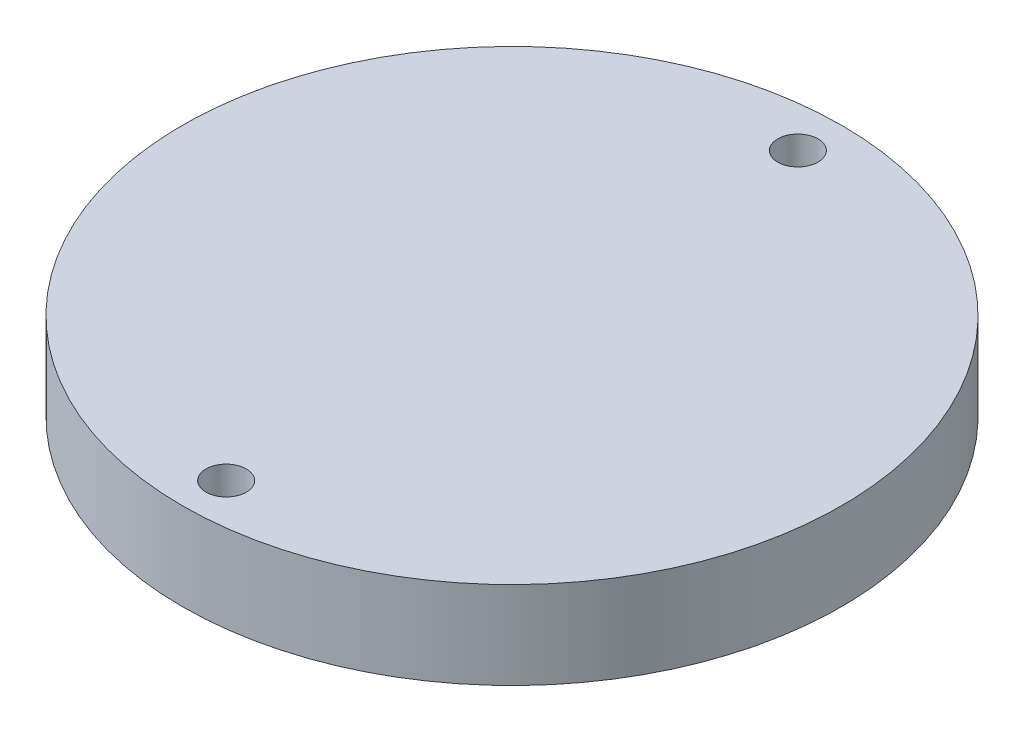
ISO-10303-21;
HEADER;
FILE_DESCRIPTION(('STEP AP214'),'2;1');
FILE_NAME('part.step','',(''),(''),'','','');
FILE_SCHEMA(('AUTOMOTIVE_DESIGN { 1 0 10303 214 1 1 1 1 }'));
ENDSEC;
DATA;
#1=APPLICATION_CONTEXT('core data for automotive mechanical design processes');
#2=APPLICATION_PROTOCOL_DEFINITION('international standard','automotive_design',2000,#1);
#3=PRODUCT_CONTEXT('',#1,'mechanical');
#4=PRODUCT('Part','Part','',(#3));
#5=PRODUCT_RELATED_PRODUCT_CATEGORY('part','',(#4));
#6=PRODUCT_DEFINITION_FORMATION('','',#4);
#7=PRODUCT_DEFINITION_CONTEXT('part definition',#1,'design');
#8=PRODUCT_DEFINITION('design','',#6,#7);
#9=PRODUCT_DEFINITION_SHAPE('','',#8);
#10=(LENGTH_UNIT() NAMED_UNIT(*) SI_UNIT(.MILLI.,.METRE.));
#11=(NAMED_UNIT(*) PLANE_ANGLE_UNIT() SI_UNIT($,.RADIAN.));
#12=(NAMED_UNIT(*) SI_UNIT($,.STERADIAN.) SOLID_ANGLE_UNIT());
#13=UNCERTAINTY_MEASURE_WITH_UNIT(LENGTH_MEASURE(1.E-05),#10,'distance_accuracy_value','');
#14=(GEOMETRIC_REPRESENTATION_CONTEXT(3) GLOBAL_UNCERTAINTY_ASSIGNED_CONTEXT((#13)) GLOBAL_UNIT_ASSIGNED_CONTEXT((#10,
#11,#12)) REPRESENTATION_CONTEXT('',''));
#15=CARTESIAN_POINT('',(0.,0.,0.));
#16=DIRECTION('',(0.,0.,1.));
#17=DIRECTION('',(1.,0.,0.));
#18=AXIS2_PLACEMENT_3D('',#15,#16,#17);
#19=CARTESIAN_POINT('',(0.,0.,0.));
#20=DIRECTION('',(0.,1.,0.));
#21=DIRECTION('',(0.,0.,1.));
#22=AXIS2_PLACEMENT_3D('',#19,#20,#21);
#23=PLANE('',#22);
#24=CARTESIAN_POINT('',(0.,0.,-21.25));
#25=DIRECTION('',(0.,-1.,0.));
#26=DIRECTION('',(0.,0.,-1.));
#27=AXIS2_PLACEMENT_3D('',#24,#25,#26);
#28=CIRCLE('',#27,1.5);
#29=CARTESIAN_POINT('',(0.,0.,-22.75));
#30=VERTEX_POINT('',#29);
#31=EDGE_CURVE('E62',#30,#30,#28,.T.);
#32=ORIENTED_EDGE('',*,*,#31,.F.);
#33=EDGE_LOOP('',(#32));
#34=FACE_BOUND('',#33,.T.);
#35=CARTESIAN_POINT('',(0.,0.,21.25));
#36=DIRECTION('',(0.,-1.,0.));
#37=DIRECTION('',(0.,0.,-1.));
#38=AXIS2_PLACEMENT_3D('',#35,#36,#37);
#39=CIRCLE('',#38,1.5);
#40=CARTESIAN_POINT('',(0.,0.,19.75));
#41=VERTEX_POINT('',#40);
#42=EDGE_CURVE('E59',#41,#41,#39,.T.);
#43=ORIENTED_EDGE('',*,*,#42,.F.);
#44=EDGE_LOOP('',(#43));
#45=FACE_BOUND('',#44,.T.);
#46=CARTESIAN_POINT('',(0.,0.,0.));
#47=DIRECTION('',(0.,1.,0.));
#48=DIRECTION('',(0.,0.,1.));
#49=AXIS2_PLACEMENT_3D('',#46,#47,#48);
#50=CIRCLE('',#49,24.5);
#51=CARTESIAN_POINT('',(0.,0.,24.5));
#52=VERTEX_POINT('',#51);
#53=EDGE_CURVE('E10',#52,#52,#50,.T.);
#54=ORIENTED_EDGE('',*,*,#53,.F.);
#55=EDGE_LOOP('',(#54));
#56=FACE_BOUND('',#55,.T.);
#57=CARTESIAN_POINT('',(0.,0.,0.));
#58=DIRECTION('',(0.,1.,0.));
#59=DIRECTION('',(0.,0.,1.));
#60=AXIS2_PLACEMENT_3D('',#57,#58,#59);
#61=CIRCLE('',#60,18.5);
#62=CARTESIAN_POINT('',(0.,0.,18.5));
#63=VERTEX_POINT('',#62);
#64=EDGE_CURVE('E42',#63,#63,#61,.T.);
#65=ORIENTED_EDGE('',*,*,#64,.T.);
#66=EDGE_LOOP('',(#65));
#67=FACE_BOUND('',#66,.T.);
#68=ADVANCED_FACE('F35',(#34,#45,#56,#67),#23,.F.);
#69=CARTESIAN_POINT('',(0.,4.5,0.));
#70=DIRECTION('',(0.,-1.,0.));
#71=DIRECTION('',(0.,0.,-1.));
#72=AXIS2_PLACEMENT_3D('',#69,#70,#71);
#73=CYLINDRICAL_SURFACE('',#72,24.5);
#74=ORIENTED_EDGE('',*,*,#53,.T.);
#75=EDGE_LOOP('',(#74));
#76=FACE_BOUND('',#75,.T.);
#77=CARTESIAN_POINT('',(0.,6.5,0.));
#78=DIRECTION('',(0.,1.,0.));
#79=DIRECTION('',(0.,0.,1.));
#80=AXIS2_PLACEMENT_3D('',#77,#78,#79);
#81=CIRCLE('',#80,24.5);
#82=CARTESIAN_POINT('',(0.,6.5,24.5));
#83=VERTEX_POINT('',#82);
#84=EDGE_CURVE('E50',#83,#83,#81,.T.);
#85=ORIENTED_EDGE('',*,*,#84,.F.);
#86=EDGE_LOOP('',(#85));
#87=FACE_BOUND('',#86,.T.);
#88=ADVANCED_FACE('F37',(#76,#87),#73,.T.);
#89=CARTESIAN_POINT('',(0.,4.5,0.));
#90=DIRECTION('',(0.,-1.,0.));
#91=DIRECTION('',(0.,0.,-1.));
#92=AXIS2_PLACEMENT_3D('',#89,#90,#91);
#93=CYLINDRICAL_SURFACE('',#92,18.5);
#94=CARTESIAN_POINT('',(0.,4.5,0.));
#95=DIRECTION('',(0.,1.,0.));
#96=DIRECTION('',(0.,0.,1.));
#97=AXIS2_PLACEMENT_3D('',#94,#95,#96);
#98=CIRCLE('',#97,18.5);
#99=CARTESIAN_POINT('',(0.,4.5,18.5));
#100=VERTEX_POINT('',#99);
#101=EDGE_CURVE('E46',#100,#100,#98,.T.);
#102=ORIENTED_EDGE('',*,*,#101,.T.);
#103=EDGE_LOOP('',(#102));
#104=FACE_BOUND('',#103,.T.);
#105=ORIENTED_EDGE('',*,*,#64,.F.);
#106=EDGE_LOOP('',(#105));
#107=FACE_BOUND('',#106,.T.);
#108=ADVANCED_FACE('F95',(#104,#107),#93,.F.);
#109=CARTESIAN_POINT('',(0.,4.5,0.));
#110=DIRECTION('',(0.,1.,0.));
#111=DIRECTION('',(0.,0.,1.));
#112=AXIS2_PLACEMENT_3D('',#109,#110,#111);
#113=PLANE('',#112);
#114=ORIENTED_EDGE('',*,*,#101,.F.);
#115=EDGE_LOOP('',(#114));
#116=FACE_BOUND('',#115,.T.);
#117=ADVANCED_FACE('F89',(#116),#113,.F.);
#118=CARTESIAN_POINT('',(0.,6.5,0.));
#119=DIRECTION('',(0.,1.,0.));
#120=DIRECTION('',(0.,0.,1.));
#121=AXIS2_PLACEMENT_3D('',#118,#119,#120);
#122=PLANE('',#121);
#123=CARTESIAN_POINT('',(0.,6.5,-21.25));
#124=DIRECTION('',(0.,-1.,0.));
#125=DIRECTION('',(0.,0.,-1.));
#126=AXIS2_PLACEMENT_3D('',#123,#124,#125);
#127=CIRCLE('',#126,1.5);
#128=CARTESIAN_POINT('',(0.,6.5,-22.75));
#129=VERTEX_POINT('',#128);
#130=EDGE_CURVE('E55',#129,#129,#127,.T.);
#131=ORIENTED_EDGE('',*,*,#130,.T.);
#132=EDGE_LOOP('',(#131));
#133=FACE_BOUND('',#132,.T.);
#134=CARTESIAN_POINT('',(0.,6.5,21.25));
#135=DIRECTION('',(0.,-1.,0.));
#136=DIRECTION('',(0.,0.,-1.));
#137=AXIS2_PLACEMENT_3D('',#134,#135,#136);
#138=CIRCLE('',#137,1.5);
#139=CARTESIAN_POINT('',(0.,6.5,19.75));
#140=VERTEX_POINT('',#139);
#141=EDGE_CURVE('E56',#140,#140,#138,.T.);
#142=ORIENTED_EDGE('',*,*,#141,.T.);
#143=EDGE_LOOP('',(#142));
#144=FACE_BOUND('',#143,.T.);
#145=ORIENTED_EDGE('',*,*,#84,.T.);
#146=EDGE_LOOP('',(#145));
#147=FACE_BOUND('',#146,.T.);
#148=ADVANCED_FACE('F68',(#133,#144,#147),#122,.T.);
#149=CARTESIAN_POINT('',(0.,6.5,21.25));
#150=DIRECTION('',(0.,-1.,0.));
#151=DIRECTION('',(0.,0.,-1.));
#152=AXIS2_PLACEMENT_3D('',#149,#150,#151);
#153=CYLINDRICAL_SURFACE('',#152,1.5);
#154=CARTESIAN_POINT('',(0.,6.5,19.75));
#155=CARTESIAN_POINT('',(0.,6.43229166666667,19.75));
#156=CARTESIAN_POINT('',(0.,6.36458333333333,19.75));
#157=CARTESIAN_POINT('',(0.,6.22916666666667,19.75));
#158=CARTESIAN_POINT('',(0.,6.16145833333333,19.75));
#159=CARTESIAN_POINT('',(0.,6.02604166666667,19.75));
#160=CARTESIAN_POINT('',(0.,5.95833333333333,19.75));
#161=CARTESIAN_POINT('',(0.,5.82291666666667,19.75));
#162=CARTESIAN_POINT('',(0.,5.75520833333333,19.75));
#163=CARTESIAN_POINT('',(0.,5.61979166666667,19.75));
#164=CARTESIAN_POINT('',(0.,5.55208333333333,19.75));
#165=CARTESIAN_POINT('',(0.,5.41666666666667,19.75));
#166=CARTESIAN_POINT('',(0.,5.34895833333333,19.75));
#167=CARTESIAN_POINT('',(0.,5.21354166666667,19.75));
#168=CARTESIAN_POINT('',(0.,5.14583333333333,19.75));
#169=CARTESIAN_POINT('',(0.,5.01041666666667,19.75));
#170=CARTESIAN_POINT('',(0.,4.94270833333333,19.75));
#171=CARTESIAN_POINT('',(0.,4.80729166666667,19.75));
#172=CARTESIAN_POINT('',(0.,4.73958333333333,19.75));
#173=CARTESIAN_POINT('',(0.,4.60416666666667,19.75));
#174=CARTESIAN_POINT('',(0.,4.53645833333333,19.75));
#175=CARTESIAN_POINT('',(0.,4.40104166666667,19.75));
#176=CARTESIAN_POINT('',(0.,4.33333333333333,19.75));
#177=CARTESIAN_POINT('',(0.,4.19791666666667,19.75));
#178=CARTESIAN_POINT('',(0.,4.13020833333333,19.75));
#179=CARTESIAN_POINT('',(0.,3.99479166666667,19.75));
#180=CARTESIAN_POINT('',(0.,3.92708333333333,19.75));
#181=CARTESIAN_POINT('',(0.,3.79166666666667,19.75));
#182=CARTESIAN_POINT('',(0.,3.72395833333333,19.75));
#183=CARTESIAN_POINT('',(0.,3.58854166666667,19.75));
#184=CARTESIAN_POINT('',(0.,3.52083333333333,19.75));
#185=CARTESIAN_POINT('',(0.,3.38541666666667,19.75));
#186=CARTESIAN_POINT('',(0.,3.31770833333333,19.75));
#187=CARTESIAN_POINT('',(0.,3.18229166666667,19.75));
#188=CARTESIAN_POINT('',(0.,3.11458333333333,19.75));
#189=CARTESIAN_POINT('',(0.,2.97916666666667,19.75));
#190=CARTESIAN_POINT('',(0.,2.91145833333333,19.75));
#191=CARTESIAN_POINT('',(0.,2.77604166666667,19.75));
#192=CARTESIAN_POINT('',(0.,2.70833333333333,19.75));
#193=CARTESIAN_POINT('',(0.,2.57291666666667,19.75));
#194=CARTESIAN_POINT('',(0.,2.50520833333333,19.75));
#195=CARTESIAN_POINT('',(0.,2.36979166666667,19.75));
#196=CARTESIAN_POINT('',(0.,2.30208333333333,19.75));
#197=CARTESIAN_POINT('',(0.,2.16666666666667,19.75));
#198=CARTESIAN_POINT('',(0.,2.09895833333333,19.75));
#199=CARTESIAN_POINT('',(0.,1.96354166666667,19.75));
#200=CARTESIAN_POINT('',(0.,1.89583333333333,19.75));
#201=CARTESIAN_POINT('',(0.,1.76041666666667,19.75));
#202=CARTESIAN_POINT('',(0.,1.69270833333333,19.75));
#203=CARTESIAN_POINT('',(0.,1.55729166666667,19.75));
#204=CARTESIAN_POINT('',(0.,1.48958333333333,19.75));
#205=CARTESIAN_POINT('',(0.,1.35416666666667,19.75));
#206=CARTESIAN_POINT('',(0.,1.28645833333333,19.75));
#207=CARTESIAN_POINT('',(0.,1.15104166666667,19.75));
#208=CARTESIAN_POINT('',(0.,1.08333333333333,19.75));
#209=CARTESIAN_POINT('',(0.,0.947916666666667,19.75));
#210=CARTESIAN_POINT('',(0.,0.880208333333333,19.75));
#211=CARTESIAN_POINT('',(0.,0.744791666666667,19.75));
#212=CARTESIAN_POINT('',(0.,0.677083333333333,19.75));
#213=CARTESIAN_POINT('',(0.,0.541666666666667,19.75));
#214=CARTESIAN_POINT('',(0.,0.473958333333333,19.75));
#215=CARTESIAN_POINT('',(0.,0.338541666666667,19.75));
#216=CARTESIAN_POINT('',(0.,0.270833333333334,19.75));
#217=CARTESIAN_POINT('',(0.,0.135416666666667,19.75));
#218=CARTESIAN_POINT('',(0.,0.0677083333333334,19.75));
#219=CARTESIAN_POINT('',(0.,0.,19.75));
#220=B_SPLINE_CURVE_WITH_KNOTS('',3,(#154,#155,#156,#157,#158,#159,#160,#161,#162,#163,#164,
#165,#166,#167,#168,#169,#170,#171,#172,#173,#174,#175,#176,#177,#178,#179,#180,#181,#182,#183,
#184,#185,#186,#187,#188,#189,#190,#191,#192,#193,#194,#195,#196,#197,#198,#199,#200,#201,#202,
#203,#204,#205,#206,#207,#208,#209,#210,#211,#212,#213,#214,#215,#216,#217,#218,#219),
.UNSPECIFIED.,.F.,.F.,(4,2,2,2,2,2,2,2,2,2,2,2,2,2,2,2,2,2,2,2,2,2,2,2,2,2,2,2,2,2,2,2,4),(0.,
0.203124999999999,0.40625,0.609375,0.8125,1.015625,1.21875,1.421875,1.625,1.828125,2.03125,
2.234375,2.4375,2.640625,2.84375,3.046875,3.25,3.453125,3.65625,3.859375,4.0625,4.265625,
4.46875,4.671875,4.875,5.078125,5.28125,5.484375,5.6875,5.890625,6.09375,6.296875,6.5),.UNSPECIFIED.);
#221=EDGE_CURVE('BSEAM74',#140,#41,#220,.T.);
#222=ORIENTED_EDGE('',*,*,#141,.F.);
#223=ORIENTED_EDGE('',*,*,#42,.T.);
#224=ORIENTED_EDGE('',*,*,#221,.T.);
#225=ORIENTED_EDGE('',*,*,#221,.F.);
#226=EDGE_LOOP('',(#222,#224,#223,#225));
#227=FACE_BOUND('',#226,.T.);
#228=ADVANCED_FACE('F74',(#227),#153,.F.);
#229=CARTESIAN_POINT('',(0.,6.5,-21.25));
#230=DIRECTION('',(0.,-1.,0.));
#231=DIRECTION('',(0.,0.,-1.));
#232=AXIS2_PLACEMENT_3D('',#229,#230,#231);
#233=CYLINDRICAL_SURFACE('',#232,1.5);
#234=CARTESIAN_POINT('',(0.,6.5,-22.75));
#235=CARTESIAN_POINT('',(0.,6.43229166666667,-22.75));
#236=CARTESIAN_POINT('',(0.,6.36458333333333,-22.75));
#237=CARTESIAN_POINT('',(0.,6.22916666666667,-22.75));
#238=CARTESIAN_POINT('',(0.,6.16145833333333,-22.75));
#239=CARTESIAN_POINT('',(0.,6.02604166666667,-22.75));
#240=CARTESIAN_POINT('',(0.,5.95833333333333,-22.75));
#241=CARTESIAN_POINT('',(0.,5.82291666666667,-22.75));
#242=CARTESIAN_POINT('',(0.,5.75520833333333,-22.75));
#243=CARTESIAN_POINT('',(0.,5.61979166666667,-22.75));
#244=CARTESIAN_POINT('',(0.,5.55208333333333,-22.75));
#245=CARTESIAN_POINT('',(0.,5.41666666666667,-22.75));
#246=CARTESIAN_POINT('',(0.,5.34895833333333,-22.75));
#247=CARTESIAN_POINT('',(0.,5.21354166666667,-22.75));
#248=CARTESIAN_POINT('',(0.,5.14583333333333,-22.75));
#249=CARTESIAN_POINT('',(0.,5.01041666666667,-22.75));
#250=CARTESIAN_POINT('',(0.,4.94270833333333,-22.75));
#251=CARTESIAN_POINT('',(0.,4.80729166666667,-22.75));
#252=CARTESIAN_POINT('',(0.,4.73958333333333,-22.75));
#253=CARTESIAN_POINT('',(0.,4.60416666666667,-22.75));
#254=CARTESIAN_POINT('',(0.,4.53645833333333,-22.75));
#255=CARTESIAN_POINT('',(0.,4.40104166666667,-22.75));
#256=CARTESIAN_POINT('',(0.,4.33333333333333,-22.75));
#257=CARTESIAN_POINT('',(0.,4.19791666666667,-22.75));
#258=CARTESIAN_POINT('',(0.,4.13020833333333,-22.75));
#259=CARTESIAN_POINT('',(0.,3.99479166666667,-22.75));
#260=CARTESIAN_POINT('',(0.,3.92708333333333,-22.75));
#261=CARTESIAN_POINT('',(0.,3.79166666666667,-22.75));
#262=CARTESIAN_POINT('',(0.,3.72395833333333,-22.75));
#263=CARTESIAN_POINT('',(0.,3.58854166666667,-22.75));
#264=CARTESIAN_POINT('',(0.,3.52083333333333,-22.75));
#265=CARTESIAN_POINT('',(0.,3.38541666666667,-22.75));
#266=CARTESIAN_POINT('',(0.,3.31770833333333,-22.75));
#267=CARTESIAN_POINT('',(0.,3.18229166666667,-22.75));
#268=CARTESIAN_POINT('',(0.,3.11458333333333,-22.75));
#269=CARTESIAN_POINT('',(0.,2.97916666666667,-22.75));
#270=CARTESIAN_POINT('',(0.,2.91145833333333,-22.75));
#271=CARTESIAN_POINT('',(0.,2.77604166666667,-22.75));
#272=CARTESIAN_POINT('',(0.,2.70833333333333,-22.75));
#273=CARTESIAN_POINT('',(0.,2.57291666666667,-22.75));
#274=CARTESIAN_POINT('',(0.,2.50520833333333,-22.75));
#275=CARTESIAN_POINT('',(0.,2.36979166666667,-22.75));
#276=CARTESIAN_POINT('',(0.,2.30208333333333,-22.75));
#277=CARTESIAN_POINT('',(0.,2.16666666666667,-22.75));
#278=CARTESIAN_POINT('',(0.,2.09895833333333,-22.75));
#279=CARTESIAN_POINT('',(0.,1.96354166666667,-22.75));
#280=CARTESIAN_POINT('',(0.,1.89583333333333,-22.75));
#281=CARTESIAN_POINT('',(0.,1.76041666666667,-22.75));
#282=CARTESIAN_POINT('',(0.,1.69270833333333,-22.75));
#283=CARTESIAN_POINT('',(0.,1.55729166666667,-22.75));
#284=CARTESIAN_POINT('',(0.,1.48958333333333,-22.75));
#285=CARTESIAN_POINT('',(0.,1.35416666666667,-22.75));
#286=CARTESIAN_POINT('',(0.,1.28645833333333,-22.75));
#287=CARTESIAN_POINT('',(0.,1.15104166666667,-22.75));
#288=CARTESIAN_POINT('',(0.,1.08333333333333,-22.75));
#289=CARTESIAN_POINT('',(0.,0.947916666666667,-22.75));
#290=CARTESIAN_POINT('',(0.,0.880208333333333,-22.75));
#291=CARTESIAN_POINT('',(0.,0.744791666666667,-22.75));
#292=CARTESIAN_POINT('',(0.,0.677083333333333,-22.75));
#293=CARTESIAN_POINT('',(0.,0.541666666666667,-22.75));
#294=CARTESIAN_POINT('',(0.,0.473958333333333,-22.75));
#295=CARTESIAN_POINT('',(0.,0.338541666666667,-22.75));
#296=CARTESIAN_POINT('',(0.,0.270833333333334,-22.75));
#297=CARTESIAN_POINT('',(0.,0.135416666666667,-22.75));
#298=CARTESIAN_POINT('',(0.,0.0677083333333334,-22.75));
#299=CARTESIAN_POINT('',(0.,0.,-22.75));
#300=B_SPLINE_CURVE_WITH_KNOTS('',3,(#234,#235,#236,#237,#238,#239,#240,#241,#242,#243,#244,
#245,#246,#247,#248,#249,#250,#251,#252,#253,#254,#255,#256,#257,#258,#259,#260,#261,#262,#263,
#264,#265,#266,#267,#268,#269,#270,#271,#272,#273,#274,#275,#276,#277,#278,#279,#280,#281,#282,
#283,#284,#285,#286,#287,#288,#289,#290,#291,#292,#293,#294,#295,#296,#297,#298,#299),
.UNSPECIFIED.,.F.,.F.,(4,2,2,2,2,2,2,2,2,2,2,2,2,2,2,2,2,2,2,2,2,2,2,2,2,2,2,2,2,2,2,2,4),(0.,
0.203124999999999,0.40625,0.609375,0.8125,1.015625,1.21875,1.421875,1.625,1.828125,2.03125,
2.234375,2.4375,2.640625,2.84375,3.046875,3.25,3.453125,3.65625,3.859375,4.0625,4.265625,
4.46875,4.671875,4.875,5.078125,5.28125,5.484375,5.6875,5.890625,6.09375,6.296875,6.5),.UNSPECIFIED.);
#301=EDGE_CURVE('BSEAM71',#129,#30,#300,.T.);
#302=ORIENTED_EDGE('',*,*,#130,.F.);
#303=ORIENTED_EDGE('',*,*,#31,.T.);
#304=ORIENTED_EDGE('',*,*,#301,.T.);
#305=ORIENTED_EDGE('',*,*,#301,.F.);
#306=EDGE_LOOP('',(#302,#304,#303,#305));
#307=FACE_BOUND('',#306,.T.);
#308=ADVANCED_FACE('F71',(#307),#233,.F.);
#309=CLOSED_SHELL('',(#68,#88,#108,#117,#148,#228,#308));
#310=MANIFOLD_SOLID_BREP('B2',#309);
#311=ADVANCED_BREP_SHAPE_REPRESENTATION('',(#18,#310),#14);
#312=SHAPE_DEFINITION_REPRESENTATION(#9,#311);
ENDSEC;
END-ISO-10303-21;
